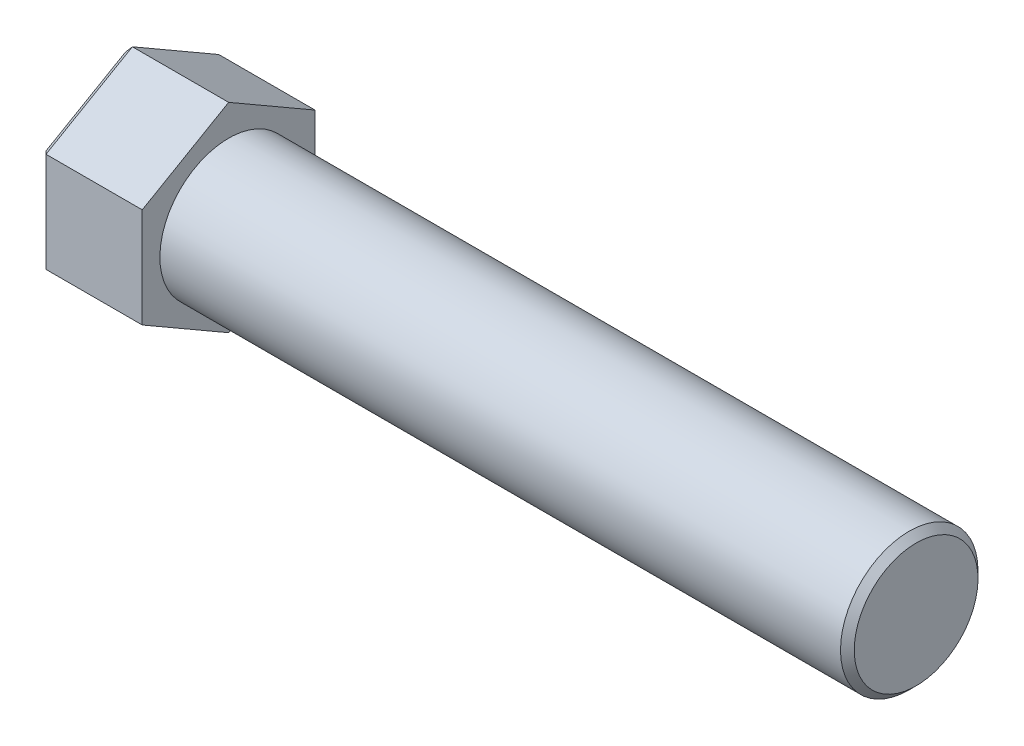
ISO-10303-21;
HEADER;
FILE_DESCRIPTION(('STEP AP214'),'2;1');
FILE_NAME('part.step','',(''),(''),'','','');
FILE_SCHEMA(('AUTOMOTIVE_DESIGN { 1 0 10303 214 1 1 1 1 }'));
ENDSEC;
DATA;
#1=APPLICATION_CONTEXT('core data for automotive mechanical design processes');
#2=APPLICATION_PROTOCOL_DEFINITION('international standard','automotive_design',2000,#1);
#3=PRODUCT_CONTEXT('',#1,'mechanical');
#4=PRODUCT('Part','Part','',(#3));
#5=PRODUCT_RELATED_PRODUCT_CATEGORY('part','',(#4));
#6=PRODUCT_DEFINITION_FORMATION('','',#4);
#7=PRODUCT_DEFINITION_CONTEXT('part definition',#1,'design');
#8=PRODUCT_DEFINITION('design','',#6,#7);
#9=PRODUCT_DEFINITION_SHAPE('','',#8);
#10=(LENGTH_UNIT() NAMED_UNIT(*) SI_UNIT(.MILLI.,.METRE.));
#11=(NAMED_UNIT(*) PLANE_ANGLE_UNIT() SI_UNIT($,.RADIAN.));
#12=(NAMED_UNIT(*) SI_UNIT($,.STERADIAN.) SOLID_ANGLE_UNIT());
#13=UNCERTAINTY_MEASURE_WITH_UNIT(LENGTH_MEASURE(1.E-05),#10,'distance_accuracy_value','');
#14=(GEOMETRIC_REPRESENTATION_CONTEXT(3) GLOBAL_UNCERTAINTY_ASSIGNED_CONTEXT((#13)) GLOBAL_UNIT_ASSIGNED_CONTEXT((#10,
#11,#12)) REPRESENTATION_CONTEXT('',''));
#15=CARTESIAN_POINT('',(0.,0.,0.));
#16=DIRECTION('',(0.,0.,1.));
#17=DIRECTION('',(1.,0.,0.));
#18=AXIS2_PLACEMENT_3D('',#15,#16,#17);
#19=CARTESIAN_POINT('',(0.,0.,0.));
#20=DIRECTION('',(-1.,0.,0.));
#21=DIRECTION('',(0.,-1.,0.));
#22=AXIS2_PLACEMENT_3D('',#19,#20,#21);
#23=PLANE('',#22);
#24=DIRECTION('',(0.,0.499999999999995,-0.866025403784442));
#25=VECTOR('',#24,1.);
#26=CARTESIAN_POINT('',(0.,7.2551368595199,12.5662656565538));
#27=LINE('',#26,#25);
#28=CARTESIAN_POINT('',(0.,7.2551368595199,12.5662656565538));
#29=VERTEX_POINT('',#28);
#30=CARTESIAN_POINT('',(0.,14.5102737190395,0.));
#31=VERTEX_POINT('',#30);
#32=EDGE_CURVE('E122',#29,#31,#27,.T.);
#33=ORIENTED_EDGE('',*,*,#32,.F.);
#34=DIRECTION('',(0.,1.,0.));
#35=VECTOR('',#34,1.);
#36=CARTESIAN_POINT('',(0.,-7.25513685951963,12.566265656554));
#37=LINE('',#36,#35);
#38=CARTESIAN_POINT('',(0.,-7.25513685951963,12.566265656554));
#39=VERTEX_POINT('',#38);
#40=EDGE_CURVE('E141',#39,#29,#37,.T.);
#41=ORIENTED_EDGE('',*,*,#40,.F.);
#42=DIRECTION('',(0.,0.500000000000007,0.866025403784435));
#43=VECTOR('',#42,1.);
#44=CARTESIAN_POINT('',(0.,-14.5102737190395,1.01324699823065E-13));
#45=LINE('',#44,#43);
#46=CARTESIAN_POINT('',(0.,-14.5102737190395,1.01324699823065E-13));
#47=VERTEX_POINT('',#46);
#48=EDGE_CURVE('E138',#47,#39,#45,.T.);
#49=ORIENTED_EDGE('',*,*,#48,.F.);
#50=DIRECTION('',(0.,-0.499999999999995,0.866025403784442));
#51=VECTOR('',#50,1.);
#52=CARTESIAN_POINT('',(0.,-7.25513685951981,-12.5662656565539));
#53=LINE('',#52,#51);
#54=CARTESIAN_POINT('',(0.,-7.25513685951981,-12.5662656565539));
#55=VERTEX_POINT('',#54);
#56=EDGE_CURVE('E135',#55,#47,#53,.T.);
#57=ORIENTED_EDGE('',*,*,#56,.F.);
#58=DIRECTION('',(0.,-1.,0.));
#59=VECTOR('',#58,1.);
#60=CARTESIAN_POINT('',(0.,7.25513685951972,-12.5662656565539));
#61=LINE('',#60,#59);
#62=CARTESIAN_POINT('',(0.,7.25513685951972,-12.5662656565539));
#63=VERTEX_POINT('',#62);
#64=EDGE_CURVE('E125',#63,#55,#61,.T.);
#65=ORIENTED_EDGE('',*,*,#64,.F.);
#66=DIRECTION('',(0.,-0.500000000000001,-0.866025403784438));
#67=VECTOR('',#66,1.);
#68=CARTESIAN_POINT('',(0.,14.5102737190395,0.));
#69=LINE('',#68,#67);
#70=EDGE_CURVE('E112',#31,#63,#69,.T.);
#71=ORIENTED_EDGE('',*,*,#70,.F.);
#72=EDGE_LOOP('',(#33,#41,#49,#57,#65,#71));
#73=FACE_BOUND('',#72,.T.);
#74=CARTESIAN_POINT('',(0.,0.,0.));
#75=DIRECTION('',(-1.,0.,0.));
#76=DIRECTION('',(0.,-1.,0.));
#77=AXIS2_PLACEMENT_3D('',#74,#75,#76);
#78=CIRCLE('',#77,10.);
#79=CARTESIAN_POINT('',(0.,-10.,0.));
#80=VERTEX_POINT('',#79);
#81=EDGE_CURVE('E115',#80,#80,#78,.T.);
#82=ORIENTED_EDGE('',*,*,#81,.T.);
#83=EDGE_LOOP('',(#82));
#84=FACE_BOUND('',#83,.T.);
#85=ADVANCED_FACE('F36',(#73,#84),#23,.F.);
#86=CARTESIAN_POINT('',(-15.,7.2551368595199,12.5662656565538));
#87=DIRECTION('',(0.,-0.866025403784442,-0.499999999999995));
#88=DIRECTION('',(0.,0.499999999999995,-0.866025403784442));
#89=AXIS2_PLACEMENT_3D('',#86,#87,#88);
#90=PLANE('',#89);
#91=DIRECTION('',(1.,0.,0.));
#92=VECTOR('',#91,1.);
#93=CARTESIAN_POINT('',(-15.,14.5102737190395,0.));
#94=LINE('',#93,#92);
#95=CARTESIAN_POINT('',(-14.,14.5102737190395,0.));
#96=VERTEX_POINT('',#95);
#97=EDGE_CURVE('E109',#96,#31,#94,.T.);
#98=ORIENTED_EDGE('',*,*,#97,.F.);
#99=DIRECTION('',(0.,-0.499999999999995,0.866025403784442));
#100=VECTOR('',#99,1.);
#101=CARTESIAN_POINT('',(-14.,7.2551368595199,12.5662656565538));
#102=LINE('',#101,#100);
#103=CARTESIAN_POINT('',(-14.,7.2551368595199,12.5662656565538));
#104=VERTEX_POINT('',#103);
#105=EDGE_CURVE('E61',#96,#104,#102,.T.);
#106=ORIENTED_EDGE('',*,*,#105,.T.);
#107=DIRECTION('',(1.,0.,0.));
#108=VECTOR('',#107,1.);
#109=CARTESIAN_POINT('',(-15.,7.2551368595199,12.5662656565538));
#110=LINE('',#109,#108);
#111=EDGE_CURVE('E128',#104,#29,#110,.T.);
#112=ORIENTED_EDGE('',*,*,#111,.T.);
#113=ORIENTED_EDGE('',*,*,#32,.T.);
#114=EDGE_LOOP('',(#98,#106,#112,#113));
#115=FACE_BOUND('',#114,.T.);
#116=ADVANCED_FACE('F127',(#115),#90,.F.);
#117=CARTESIAN_POINT('',(-15.,14.5102737190395,0.));
#118=DIRECTION('',(0.,-0.866025403784438,0.500000000000001));
#119=DIRECTION('',(0.,-0.500000000000001,-0.866025403784438));
#120=AXIS2_PLACEMENT_3D('',#117,#118,#119);
#121=PLANE('',#120);
#122=DIRECTION('',(1.,0.,0.));
#123=VECTOR('',#122,1.);
#124=CARTESIAN_POINT('',(-15.,7.25513685951972,-12.5662656565539));
#125=LINE('',#124,#123);
#126=CARTESIAN_POINT('',(-14.,7.25513685951972,-12.5662656565539));
#127=VERTEX_POINT('',#126);
#128=EDGE_CURVE('E116',#127,#63,#125,.T.);
#129=ORIENTED_EDGE('',*,*,#128,.F.);
#130=DIRECTION('',(0.,0.500000000000001,0.866025403784438));
#131=VECTOR('',#130,1.);
#132=CARTESIAN_POINT('',(-14.,14.5102737190395,0.));
#133=LINE('',#132,#131);
#134=EDGE_CURVE('E54',#127,#96,#133,.T.);
#135=ORIENTED_EDGE('',*,*,#134,.T.);
#136=ORIENTED_EDGE('',*,*,#97,.T.);
#137=ORIENTED_EDGE('',*,*,#70,.T.);
#138=EDGE_LOOP('',(#129,#135,#136,#137));
#139=FACE_BOUND('',#138,.T.);
#140=ADVANCED_FACE('F111',(#139),#121,.F.);
#141=CARTESIAN_POINT('',(-15.,7.25513685951972,-12.5662656565539));
#142=DIRECTION('',(0.,0.,1.));
#143=DIRECTION('',(0.,-1.,0.));
#144=AXIS2_PLACEMENT_3D('',#141,#142,#143);
#145=PLANE('',#144);
#146=DIRECTION('',(1.,0.,0.));
#147=VECTOR('',#146,1.);
#148=CARTESIAN_POINT('',(-15.,-7.25513685951981,-12.5662656565539));
#149=LINE('',#148,#147);
#150=CARTESIAN_POINT('',(-14.,-7.25513685951981,-12.5662656565539));
#151=VERTEX_POINT('',#150);
#152=EDGE_CURVE('E148',#151,#55,#149,.T.);
#153=ORIENTED_EDGE('',*,*,#152,.F.);
#154=DIRECTION('',(0.,1.,0.));
#155=VECTOR('',#154,1.);
#156=CARTESIAN_POINT('',(-14.,7.25513685951972,-12.5662656565539));
#157=LINE('',#156,#155);
#158=EDGE_CURVE('E166',#151,#127,#157,.T.);
#159=ORIENTED_EDGE('',*,*,#158,.T.);
#160=ORIENTED_EDGE('',*,*,#128,.T.);
#161=ORIENTED_EDGE('',*,*,#64,.T.);
#162=EDGE_LOOP('',(#153,#159,#160,#161));
#163=FACE_BOUND('',#162,.T.);
#164=ADVANCED_FACE('F216',(#163),#145,.F.);
#165=CARTESIAN_POINT('',(-15.,-7.25513685951981,-12.5662656565539));
#166=DIRECTION('',(0.,0.866025403784442,0.499999999999995));
#167=DIRECTION('',(0.,-0.499999999999995,0.866025403784442));
#168=AXIS2_PLACEMENT_3D('',#165,#166,#167);
#169=PLANE('',#168);
#170=DIRECTION('',(1.,0.,0.));
#171=VECTOR('',#170,1.);
#172=CARTESIAN_POINT('',(-15.,-14.5102737190395,1.01324699823065E-13));
#173=LINE('',#172,#171);
#174=CARTESIAN_POINT('',(-14.,-14.5102737190395,1.01324699823065E-13));
#175=VERTEX_POINT('',#174);
#176=EDGE_CURVE('E146',#175,#47,#173,.T.);
#177=ORIENTED_EDGE('',*,*,#176,.F.);
#178=DIRECTION('',(0.,0.499999999999995,-0.866025403784442));
#179=VECTOR('',#178,1.);
#180=CARTESIAN_POINT('',(-14.,-7.25513685951981,-12.5662656565539));
#181=LINE('',#180,#179);
#182=EDGE_CURVE('E169',#175,#151,#181,.T.);
#183=ORIENTED_EDGE('',*,*,#182,.T.);
#184=ORIENTED_EDGE('',*,*,#152,.T.);
#185=ORIENTED_EDGE('',*,*,#56,.T.);
#186=EDGE_LOOP('',(#177,#183,#184,#185));
#187=FACE_BOUND('',#186,.T.);
#188=ADVANCED_FACE('F213',(#187),#169,.F.);
#189=CARTESIAN_POINT('',(-15.,-14.5102737190395,1.01324699823065E-13));
#190=DIRECTION('',(0.,0.866025403784435,-0.500000000000007));
#191=DIRECTION('',(0.,0.500000000000007,0.866025403784435));
#192=AXIS2_PLACEMENT_3D('',#189,#190,#191);
#193=PLANE('',#192);
#194=DIRECTION('',(1.,0.,0.));
#195=VECTOR('',#194,1.);
#196=CARTESIAN_POINT('',(-15.,-7.25513685951963,12.566265656554));
#197=LINE('',#196,#195);
#198=CARTESIAN_POINT('',(-14.,-7.25513685951963,12.566265656554));
#199=VERTEX_POINT('',#198);
#200=EDGE_CURVE('E144',#199,#39,#197,.T.);
#201=ORIENTED_EDGE('',*,*,#200,.F.);
#202=DIRECTION('',(0.,-0.500000000000007,-0.866025403784435));
#203=VECTOR('',#202,1.);
#204=CARTESIAN_POINT('',(-14.,-14.5102737190395,1.01291129033256E-13));
#205=LINE('',#204,#203);
#206=EDGE_CURVE('E171',#199,#175,#205,.T.);
#207=ORIENTED_EDGE('',*,*,#206,.T.);
#208=ORIENTED_EDGE('',*,*,#176,.T.);
#209=ORIENTED_EDGE('',*,*,#48,.T.);
#210=EDGE_LOOP('',(#201,#207,#208,#209));
#211=FACE_BOUND('',#210,.T.);
#212=ADVANCED_FACE('F245',(#211),#193,.F.);
#213=CARTESIAN_POINT('',(-15.,-7.25513685951963,12.566265656554));
#214=DIRECTION('',(0.,0.,-1.));
#215=DIRECTION('',(0.,1.,0.));
#216=AXIS2_PLACEMENT_3D('',#213,#214,#215);
#217=PLANE('',#216);
#218=ORIENTED_EDGE('',*,*,#111,.F.);
#219=DIRECTION('',(0.,-1.,0.));
#220=VECTOR('',#219,1.);
#221=CARTESIAN_POINT('',(-14.,-7.25513685951963,12.566265656554));
#222=LINE('',#221,#220);
#223=EDGE_CURVE('E173',#104,#199,#222,.T.);
#224=ORIENTED_EDGE('',*,*,#223,.T.);
#225=ORIENTED_EDGE('',*,*,#200,.T.);
#226=ORIENTED_EDGE('',*,*,#40,.T.);
#227=EDGE_LOOP('',(#218,#224,#225,#226));
#228=FACE_BOUND('',#227,.T.);
#229=ADVANCED_FACE('F242',(#228),#217,.F.);
#230=CARTESIAN_POINT('',(-15.,0.,0.));
#231=DIRECTION('',(-1.,0.,0.));
#232=DIRECTION('',(0.,-1.,0.));
#233=AXIS2_PLACEMENT_3D('',#230,#231,#232);
#234=PLANE('',#233);
#235=DIRECTION('',(0.,-0.500000000000001,-0.866025403784438));
#236=VECTOR('',#235,1.);
#237=CARTESIAN_POINT('',(-15.,6.38911145573528,-12.0662656565539));
#238=LINE('',#237,#236);
#239=CARTESIAN_POINT('',(-15.,13.3555731806602,0.));
#240=VERTEX_POINT('',#239);
#241=CARTESIAN_POINT('',(-15.,6.6777865903301,-11.5662656565539));
#242=VERTEX_POINT('',#241);
#243=EDGE_CURVE('E155',#240,#242,#238,.T.);
#244=ORIENTED_EDGE('',*,*,#243,.T.);
#245=DIRECTION('',(0.,-1.,0.));
#246=VECTOR('',#245,1.);
#247=CARTESIAN_POINT('',(-15.,-7.2551368595198,-11.5662656565539));
#248=LINE('',#247,#246);
#249=CARTESIAN_POINT('',(-15.,-6.67778659033017,-11.5662656565539));
#250=VERTEX_POINT('',#249);
#251=EDGE_CURVE('E163',#242,#250,#248,.T.);
#252=ORIENTED_EDGE('',*,*,#251,.T.);
#253=DIRECTION('',(0.,-0.499999999999995,0.866025403784442));
#254=VECTOR('',#253,1.);
#255=CARTESIAN_POINT('',(-15.,-13.6442483152551,0.500000000000096));
#256=LINE('',#255,#254);
#257=CARTESIAN_POINT('',(-15.,-13.3555731806602,0.));
#258=VERTEX_POINT('',#257);
#259=EDGE_CURVE('E161',#250,#258,#256,.T.);
#260=ORIENTED_EDGE('',*,*,#259,.T.);
#261=DIRECTION('',(0.,0.500000000000007,0.866025403784435));
#262=VECTOR('',#261,1.);
#263=CARTESIAN_POINT('',(-15.,-6.38911145573519,12.066265656554));
#264=LINE('',#263,#262);
#265=CARTESIAN_POINT('',(-15.,-6.67778659033001,11.566265656554));
#266=VERTEX_POINT('',#265);
#267=EDGE_CURVE('E159',#258,#266,#264,.T.);
#268=ORIENTED_EDGE('',*,*,#267,.T.);
#269=DIRECTION('',(0.,1.,0.));
#270=VECTOR('',#269,1.);
#271=CARTESIAN_POINT('',(-15.,7.25513685951989,11.5662656565538));
#272=LINE('',#271,#270);
#273=CARTESIAN_POINT('',(-15.,6.67778659033026,11.5662656565538));
#274=VERTEX_POINT('',#273);
#275=EDGE_CURVE('E157',#266,#274,#272,.T.);
#276=ORIENTED_EDGE('',*,*,#275,.T.);
#277=DIRECTION('',(0.,0.499999999999995,-0.866025403784441));
#278=VECTOR('',#277,1.);
#279=CARTESIAN_POINT('',(-15.,13.6442483152551,-0.499999999999994));
#280=LINE('',#279,#278);
#281=EDGE_CURVE('E153',#274,#240,#280,.T.);
#282=ORIENTED_EDGE('',*,*,#281,.T.);
#283=EDGE_LOOP('',(#244,#252,#260,#268,#276,#282));
#284=FACE_BOUND('',#283,.T.);
#285=ADVANCED_FACE('F202',(#284),#234,.T.);
#286=CARTESIAN_POINT('',(100.,0.,0.));
#287=DIRECTION('',(-1.,0.,0.));
#288=DIRECTION('',(0.,-1.,0.));
#289=AXIS2_PLACEMENT_3D('',#286,#287,#288);
#290=CYLINDRICAL_SURFACE('',#289,10.);
#291=CARTESIAN_POINT('',(99.,0.,0.));
#292=DIRECTION('',(1.,0.,0.));
#293=DIRECTION('',(0.,1.,0.));
#294=AXIS2_PLACEMENT_3D('',#291,#292,#293);
#295=CIRCLE('',#294,10.);
#296=CARTESIAN_POINT('',(99.,9.99999999999999,0.));
#297=VERTEX_POINT('',#296);
#298=EDGE_CURVE('E11',#297,#297,#295,.F.);
#299=ORIENTED_EDGE('',*,*,#298,.T.);
#300=EDGE_LOOP('',(#299));
#301=FACE_BOUND('',#300,.T.);
#302=ORIENTED_EDGE('',*,*,#81,.F.);
#303=EDGE_LOOP('',(#302));
#304=FACE_BOUND('',#303,.T.);
#305=ADVANCED_FACE('F258',(#301,#304),#290,.T.);
#306=CARTESIAN_POINT('',(100.,0.,0.));
#307=DIRECTION('',(1.,0.,0.));
#308=DIRECTION('',(0.,1.,0.));
#309=AXIS2_PLACEMENT_3D('',#306,#307,#308);
#310=PLANE('',#309);
#311=CARTESIAN_POINT('',(100.,0.,0.));
#312=DIRECTION('',(1.,0.,0.));
#313=DIRECTION('',(0.,1.,0.));
#314=AXIS2_PLACEMENT_3D('',#311,#312,#313);
#315=CIRCLE('',#314,8.99999999999999);
#316=CARTESIAN_POINT('',(100.,8.99999999999999,0.));
#317=VERTEX_POINT('',#316);
#318=EDGE_CURVE('E46',#317,#317,#315,.T.);
#319=ORIENTED_EDGE('',*,*,#318,.T.);
#320=EDGE_LOOP('',(#319));
#321=FACE_BOUND('',#320,.T.);
#322=ADVANCED_FACE('F232',(#321),#310,.T.);
#323=CARTESIAN_POINT('',(-15.,1.2260161662732E-13,11.5662656565539));
#324=DIRECTION('',(-0.707106781186547,0.,0.707106781186548));
#325=DIRECTION('',(0.,-1.,0.));
#326=AXIS2_PLACEMENT_3D('',#323,#324,#325);
#327=PLANE('',#326);
#328=DIRECTION('',(0.654653670707977,-0.377964473009222,0.654653670707981));
#329=VECTOR('',#328,1.);
#330=CARTESIAN_POINT('',(-16.652323665222,-5.72381707742572,9.91394199133196));
#331=LINE('',#330,#329);
#332=EDGE_CURVE('E132',#199,#266,#331,.F.);
#333=ORIENTED_EDGE('',*,*,#332,.F.);
#334=ORIENTED_EDGE('',*,*,#223,.F.);
#335=DIRECTION('',(0.654653670707978,0.377964473009232,0.654653670707974));
#336=VECTOR('',#335,1.);
#337=CARTESIAN_POINT('',(-16.652323665222,5.72381707742596,9.91394199133187));
#338=LINE('',#337,#336);
#339=EDGE_CURVE('E41',#274,#104,#338,.T.);
#340=ORIENTED_EDGE('',*,*,#339,.F.);
#341=ORIENTED_EDGE('',*,*,#275,.F.);
#342=EDGE_LOOP('',(#333,#334,#340,#341));
#343=FACE_BOUND('',#342,.T.);
#344=ADVANCED_FACE('F198',(#343),#327,.T.);
#345=CARTESIAN_POINT('',(-15.,10.0166798854953,5.78313282827692));
#346=DIRECTION('',(-0.707106781186547,0.612372435695797,0.35355339059327));
#347=DIRECTION('',(0.,-0.499999999999995,0.866025403784442));
#348=AXIS2_PLACEMENT_3D('',#345,#346,#347);
#349=PLANE('',#348);
#350=ORIENTED_EDGE('',*,*,#339,.T.);
#351=ORIENTED_EDGE('',*,*,#105,.F.);
#352=DIRECTION('',(-0.654653670707978,-0.755928946018454,0.));
#353=VECTOR('',#352,1.);
#354=CARTESIAN_POINT('',(-16.652323665222,11.4476341548517,0.));
#355=LINE('',#354,#353);
#356=EDGE_CURVE('E186',#240,#96,#355,.F.);
#357=ORIENTED_EDGE('',*,*,#356,.F.);
#358=ORIENTED_EDGE('',*,*,#281,.F.);
#359=EDGE_LOOP('',(#350,#351,#357,#358));
#360=FACE_BOUND('',#359,.T.);
#361=ADVANCED_FACE('F224',(#360),#349,.T.);
#362=CARTESIAN_POINT('',(-15.,-10.0166798854951,5.78313282827703));
#363=DIRECTION('',(-0.707106781186548,-0.612372435695791,0.353553390593278));
#364=DIRECTION('',(0.,-0.500000000000007,-0.866025403784435));
#365=AXIS2_PLACEMENT_3D('',#362,#363,#364);
#366=PLANE('',#365);
#367=ORIENTED_EDGE('',*,*,#332,.T.);
#368=ORIENTED_EDGE('',*,*,#267,.F.);
#369=DIRECTION('',(0.654653670707977,-0.755928946018455,0.));
#370=VECTOR('',#369,1.);
#371=CARTESIAN_POINT('',(-16.652323665222,-11.4476341548516,0.));
#372=LINE('',#371,#370);
#373=EDGE_CURVE('E183',#175,#258,#372,.F.);
#374=ORIENTED_EDGE('',*,*,#373,.F.);
#375=ORIENTED_EDGE('',*,*,#206,.F.);
#376=EDGE_LOOP('',(#367,#368,#374,#375));
#377=FACE_BOUND('',#376,.T.);
#378=ADVANCED_FACE('F193',(#377),#366,.T.);
#379=CARTESIAN_POINT('',(-15.,10.0166798854952,-5.78313282827696));
#380=DIRECTION('',(-0.707106781186547,0.612372435695794,-0.353553390593274));
#381=DIRECTION('',(0.,0.500000000000001,0.866025403784438));
#382=AXIS2_PLACEMENT_3D('',#379,#380,#381);
#383=PLANE('',#382);
#384=ORIENTED_EDGE('',*,*,#356,.T.);
#385=ORIENTED_EDGE('',*,*,#134,.F.);
#386=DIRECTION('',(-0.654653670707977,-0.377964473009226,0.654653670707978));
#387=VECTOR('',#386,1.);
#388=CARTESIAN_POINT('',(-16.652323665222,5.72381707742579,-9.91394199133193));
#389=LINE('',#388,#387);
#390=EDGE_CURVE('E181',#242,#127,#389,.F.);
#391=ORIENTED_EDGE('',*,*,#390,.F.);
#392=ORIENTED_EDGE('',*,*,#243,.F.);
#393=EDGE_LOOP('',(#384,#385,#391,#392));
#394=FACE_BOUND('',#393,.T.);
#395=ADVANCED_FACE('F222',(#394),#383,.T.);
#396=CARTESIAN_POINT('',(-15.,-10.0166798854952,-5.78313282827689));
#397=DIRECTION('',(-0.707106781186547,-0.612372435695797,-0.35355339059327));
#398=DIRECTION('',(0.,0.499999999999995,-0.866025403784442));
#399=AXIS2_PLACEMENT_3D('',#396,#397,#398);
#400=PLANE('',#399);
#401=ORIENTED_EDGE('',*,*,#373,.T.);
#402=ORIENTED_EDGE('',*,*,#259,.F.);
#403=DIRECTION('',(0.654653670707977,-0.37796447300923,-0.654653670707975));
#404=VECTOR('',#403,1.);
#405=CARTESIAN_POINT('',(-16.652323665222,-5.72381707742586,-9.91394199133189));
#406=LINE('',#405,#404);
#407=EDGE_CURVE('E179',#151,#250,#406,.F.);
#408=ORIENTED_EDGE('',*,*,#407,.F.);
#409=ORIENTED_EDGE('',*,*,#182,.F.);
#410=EDGE_LOOP('',(#401,#402,#408,#409));
#411=FACE_BOUND('',#410,.T.);
#412=ADVANCED_FACE('F208',(#411),#400,.T.);
#413=CARTESIAN_POINT('',(-15.,0.,-11.5662656565539));
#414=DIRECTION('',(-0.707106781186547,0.,-0.707106781186548));
#415=DIRECTION('',(0.,1.,0.));
#416=AXIS2_PLACEMENT_3D('',#413,#414,#415);
#417=PLANE('',#416);
#418=ORIENTED_EDGE('',*,*,#390,.T.);
#419=ORIENTED_EDGE('',*,*,#158,.F.);
#420=ORIENTED_EDGE('',*,*,#407,.T.);
#421=ORIENTED_EDGE('',*,*,#251,.F.);
#422=EDGE_LOOP('',(#418,#419,#420,#421));
#423=FACE_BOUND('',#422,.T.);
#424=ADVANCED_FACE('F218',(#423),#417,.T.);
#425=CARTESIAN_POINT('',(100.,0.,0.));
#426=DIRECTION('',(-1.,0.,0.));
#427=DIRECTION('',(0.,-1.,0.));
#428=AXIS2_PLACEMENT_3D('',#425,#426,#427);
#429=CONICAL_SURFACE('',#428,8.99999999999999,0.785398163397444);
#430=ORIENTED_EDGE('',*,*,#298,.F.);
#431=EDGE_LOOP('',(#430));
#432=FACE_BOUND('',#431,.T.);
#433=ORIENTED_EDGE('',*,*,#318,.F.);
#434=EDGE_LOOP('',(#433));
#435=FACE_BOUND('',#434,.T.);
#436=ADVANCED_FACE('F39',(#432,#435),#429,.T.);
#437=CLOSED_SHELL('',(#85,#116,#140,#164,#188,#212,#229,#285,#305,#322,#344,#361,#378,#395,#412,
#424,#436));
#438=MANIFOLD_SOLID_BREP('B2',#437);
#439=ADVANCED_BREP_SHAPE_REPRESENTATION('',(#18,#438),#14);
#440=SHAPE_DEFINITION_REPRESENTATION(#9,#439);
ENDSEC;
END-ISO-10303-21;
